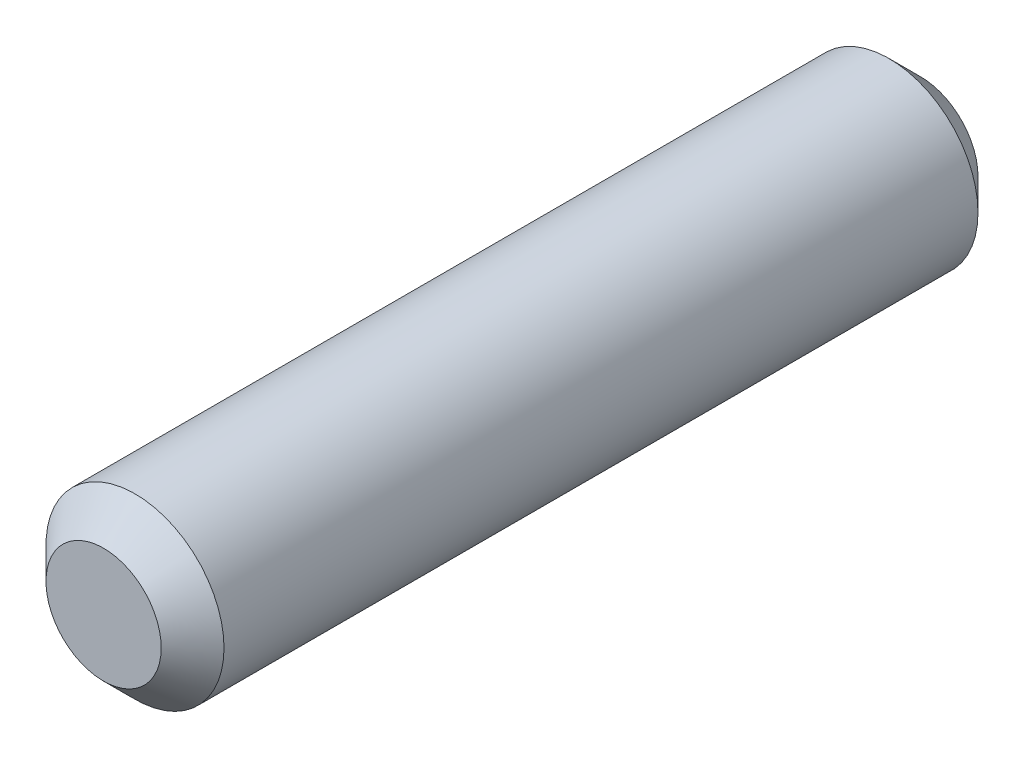
ISO-10303-21;
HEADER;
FILE_DESCRIPTION(('STEP AP214'),'2;1');
FILE_NAME('part.step','',(''),(''),'','','');
FILE_SCHEMA(('AUTOMOTIVE_DESIGN { 1 0 10303 214 1 1 1 1 }'));
ENDSEC;
DATA;
#1=APPLICATION_CONTEXT('core data for automotive mechanical design processes');
#2=APPLICATION_PROTOCOL_DEFINITION('international standard','automotive_design',2000,#1);
#3=PRODUCT_CONTEXT('',#1,'mechanical');
#4=PRODUCT('Part','Part','',(#3));
#5=PRODUCT_RELATED_PRODUCT_CATEGORY('part','',(#4));
#6=PRODUCT_DEFINITION_FORMATION('','',#4);
#7=PRODUCT_DEFINITION_CONTEXT('part definition',#1,'design');
#8=PRODUCT_DEFINITION('design','',#6,#7);
#9=PRODUCT_DEFINITION_SHAPE('','',#8);
#10=(LENGTH_UNIT() NAMED_UNIT(*) SI_UNIT(.MILLI.,.METRE.));
#11=(NAMED_UNIT(*) PLANE_ANGLE_UNIT() SI_UNIT($,.RADIAN.));
#12=(NAMED_UNIT(*) SI_UNIT($,.STERADIAN.) SOLID_ANGLE_UNIT());
#13=UNCERTAINTY_MEASURE_WITH_UNIT(LENGTH_MEASURE(1.E-05),#10,'distance_accuracy_value','');
#14=(GEOMETRIC_REPRESENTATION_CONTEXT(3) GLOBAL_UNCERTAINTY_ASSIGNED_CONTEXT((#13)) GLOBAL_UNIT_ASSIGNED_CONTEXT((#10,
#11,#12)) REPRESENTATION_CONTEXT('',''));
#15=CARTESIAN_POINT('',(0.,0.,0.));
#16=DIRECTION('',(0.,0.,1.));
#17=DIRECTION('',(1.,0.,0.));
#18=AXIS2_PLACEMENT_3D('',#15,#16,#17);
#19=CARTESIAN_POINT('',(0.,0.,39.));
#20=DIRECTION('',(0.,0.,-1.));
#21=DIRECTION('',(-1.,0.,0.));
#22=AXIS2_PLACEMENT_3D('',#19,#20,#21);
#23=CYLINDRICAL_SURFACE('',#22,8.50000000000001);
#24=CARTESIAN_POINT('',(0.,0.,-36.));
#25=DIRECTION('',(0.,0.,1.));
#26=DIRECTION('',(1.,0.,0.));
#27=AXIS2_PLACEMENT_3D('',#24,#25,#26);
#28=CIRCLE('',#27,8.50000000000001);
#29=CARTESIAN_POINT('',(8.50000000000001,0.,-36.));
#30=VERTEX_POINT('',#29);
#31=EDGE_CURVE('E43',#30,#30,#28,.T.);
#32=ORIENTED_EDGE('',*,*,#31,.T.);
#33=EDGE_LOOP('',(#32));
#34=FACE_BOUND('',#33,.T.);
#35=CARTESIAN_POINT('',(0.,0.,36.));
#36=DIRECTION('',(0.,0.,1.));
#37=DIRECTION('',(1.,0.,0.));
#38=AXIS2_PLACEMENT_3D('',#35,#36,#37);
#39=CIRCLE('',#38,8.50000000000001);
#40=CARTESIAN_POINT('',(8.50000000000001,0.,36.));
#41=VERTEX_POINT('',#40);
#42=EDGE_CURVE('E47',#41,#41,#39,.F.);
#43=ORIENTED_EDGE('',*,*,#42,.T.);
#44=EDGE_LOOP('',(#43));
#45=FACE_BOUND('',#44,.T.);
#46=ADVANCED_FACE('F32',(#34,#45),#23,.T.);
#47=CARTESIAN_POINT('',(0.,0.,39.));
#48=DIRECTION('',(0.,0.,1.));
#49=DIRECTION('',(1.,0.,0.));
#50=AXIS2_PLACEMENT_3D('',#47,#48,#49);
#51=PLANE('',#50);
#52=CARTESIAN_POINT('',(0.,0.,39.));
#53=DIRECTION('',(0.,0.,1.));
#54=DIRECTION('',(1.,0.,0.));
#55=AXIS2_PLACEMENT_3D('',#52,#53,#54);
#56=CIRCLE('',#55,5.49999999999999);
#57=CARTESIAN_POINT('',(5.49999999999999,0.,39.));
#58=VERTEX_POINT('',#57);
#59=EDGE_CURVE('E10',#58,#58,#56,.T.);
#60=ORIENTED_EDGE('',*,*,#59,.T.);
#61=EDGE_LOOP('',(#60));
#62=FACE_BOUND('',#61,.T.);
#63=ADVANCED_FACE('F63',(#62),#51,.T.);
#64=CARTESIAN_POINT('',(0.,0.,-39.));
#65=DIRECTION('',(0.,0.,1.));
#66=DIRECTION('',(1.,0.,0.));
#67=AXIS2_PLACEMENT_3D('',#64,#65,#66);
#68=PLANE('',#67);
#69=CARTESIAN_POINT('',(0.,0.,-39.));
#70=DIRECTION('',(0.,0.,1.));
#71=DIRECTION('',(1.,0.,0.));
#72=AXIS2_PLACEMENT_3D('',#69,#70,#71);
#73=CIRCLE('',#72,5.49999999999999);
#74=CARTESIAN_POINT('',(5.49999999999999,0.,-39.));
#75=VERTEX_POINT('',#74);
#76=EDGE_CURVE('E39',#75,#75,#73,.F.);
#77=ORIENTED_EDGE('',*,*,#76,.T.);
#78=EDGE_LOOP('',(#77));
#79=FACE_BOUND('',#78,.T.);
#80=ADVANCED_FACE('F60',(#79),#68,.F.);
#81=CARTESIAN_POINT('',(0.,0.,-36.));
#82=DIRECTION('',(0.,0.,1.));
#83=DIRECTION('',(1.,0.,0.));
#84=AXIS2_PLACEMENT_3D('',#81,#82,#83);
#85=CONICAL_SURFACE('',#84,8.50000000000001,0.785398163397451);
#86=ORIENTED_EDGE('',*,*,#76,.F.);
#87=EDGE_LOOP('',(#86));
#88=FACE_BOUND('',#87,.T.);
#89=ORIENTED_EDGE('',*,*,#31,.F.);
#90=EDGE_LOOP('',(#89));
#91=FACE_BOUND('',#90,.T.);
#92=ADVANCED_FACE('F56',(#88,#91),#85,.T.);
#93=CARTESIAN_POINT('',(0.,0.,39.));
#94=DIRECTION('',(0.,0.,-1.));
#95=DIRECTION('',(-1.,0.,0.));
#96=AXIS2_PLACEMENT_3D('',#93,#94,#95);
#97=CONICAL_SURFACE('',#96,5.49999999999999,0.785398163397448);
#98=ORIENTED_EDGE('',*,*,#42,.F.);
#99=EDGE_LOOP('',(#98));
#100=FACE_BOUND('',#99,.T.);
#101=ORIENTED_EDGE('',*,*,#59,.F.);
#102=EDGE_LOOP('',(#101));
#103=FACE_BOUND('',#102,.T.);
#104=ADVANCED_FACE('F34',(#100,#103),#97,.T.);
#105=CLOSED_SHELL('',(#46,#63,#80,#92,#104));
#106=MANIFOLD_SOLID_BREP('B2',#105);
#107=ADVANCED_BREP_SHAPE_REPRESENTATION('',(#18,#106),#14);
#108=SHAPE_DEFINITION_REPRESENTATION(#9,#107);
ENDSEC;
END-ISO-10303-21;
